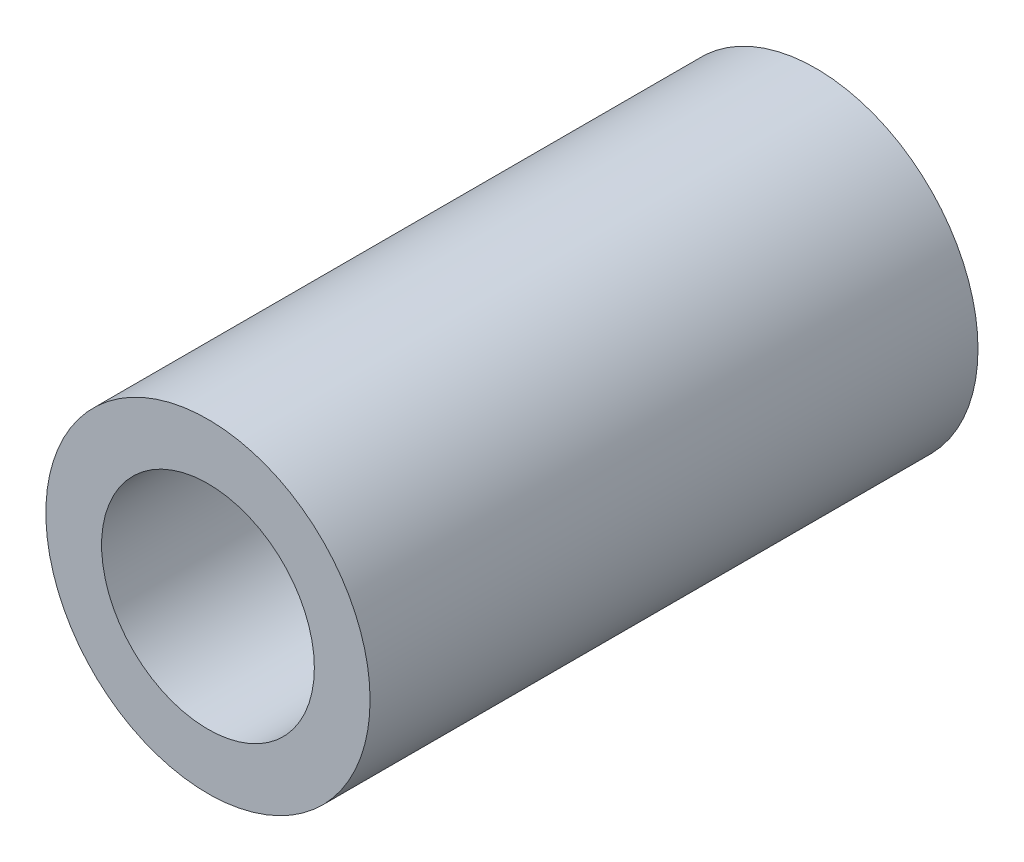
ISO-10303-21;
HEADER;
FILE_DESCRIPTION(('STEP AP214'),'2;1');
FILE_NAME('part.step','',(''),(''),'','','');
FILE_SCHEMA(('AUTOMOTIVE_DESIGN { 1 0 10303 214 1 1 1 1 }'));
ENDSEC;
DATA;
#1=APPLICATION_CONTEXT('core data for automotive mechanical design processes');
#2=APPLICATION_PROTOCOL_DEFINITION('international standard','automotive_design',2000,#1);
#3=PRODUCT_CONTEXT('',#1,'mechanical');
#4=PRODUCT('Part','Part','',(#3));
#5=PRODUCT_RELATED_PRODUCT_CATEGORY('part','',(#4));
#6=PRODUCT_DEFINITION_FORMATION('','',#4);
#7=PRODUCT_DEFINITION_CONTEXT('part definition',#1,'design');
#8=PRODUCT_DEFINITION('design','',#6,#7);
#9=PRODUCT_DEFINITION_SHAPE('','',#8);
#10=(LENGTH_UNIT() NAMED_UNIT(*) SI_UNIT(.MILLI.,.METRE.));
#11=(NAMED_UNIT(*) PLANE_ANGLE_UNIT() SI_UNIT($,.RADIAN.));
#12=(NAMED_UNIT(*) SI_UNIT($,.STERADIAN.) SOLID_ANGLE_UNIT());
#13=UNCERTAINTY_MEASURE_WITH_UNIT(LENGTH_MEASURE(1.E-05),#10,'distance_accuracy_value','');
#14=(GEOMETRIC_REPRESENTATION_CONTEXT(3) GLOBAL_UNCERTAINTY_ASSIGNED_CONTEXT((#13)) GLOBAL_UNIT_ASSIGNED_CONTEXT((#10,
#11,#12)) REPRESENTATION_CONTEXT('',''));
#15=CARTESIAN_POINT('',(0.,0.,0.));
#16=DIRECTION('',(0.,0.,1.));
#17=DIRECTION('',(1.,0.,0.));
#18=AXIS2_PLACEMENT_3D('',#15,#16,#17);
#19=CARTESIAN_POINT('',(0.,0.,15.));
#20=DIRECTION('',(0.,0.,1.));
#21=DIRECTION('',(1.,0.,0.));
#22=AXIS2_PLACEMENT_3D('',#19,#20,#21);
#23=PLANE('',#22);
#24=CARTESIAN_POINT('',(0.,0.,15.));
#25=DIRECTION('',(0.,0.,1.));
#26=DIRECTION('',(1.,0.,0.));
#27=AXIS2_PLACEMENT_3D('',#24,#25,#26);
#28=CIRCLE('',#27,8.);
#29=CARTESIAN_POINT('',(8.,0.,15.));
#30=VERTEX_POINT('',#29);
#31=EDGE_CURVE('E10',#30,#30,#28,.T.);
#32=ORIENTED_EDGE('',*,*,#31,.T.);
#33=EDGE_LOOP('',(#32));
#34=FACE_BOUND('',#33,.T.);
#35=CARTESIAN_POINT('',(0.,0.,15.));
#36=DIRECTION('',(0.,0.,1.));
#37=DIRECTION('',(1.,0.,0.));
#38=AXIS2_PLACEMENT_3D('',#35,#36,#37);
#39=CIRCLE('',#38,5.25);
#40=CARTESIAN_POINT('',(5.25,0.,15.));
#41=VERTEX_POINT('',#40);
#42=EDGE_CURVE('E44',#41,#41,#39,.T.);
#43=ORIENTED_EDGE('',*,*,#42,.F.);
#44=EDGE_LOOP('',(#43));
#45=FACE_BOUND('',#44,.T.);
#46=ADVANCED_FACE('F33',(#34,#45),#23,.T.);
#47=CARTESIAN_POINT('',(0.,0.,-15.));
#48=DIRECTION('',(0.,0.,1.));
#49=DIRECTION('',(1.,0.,0.));
#50=AXIS2_PLACEMENT_3D('',#47,#48,#49);
#51=PLANE('',#50);
#52=CARTESIAN_POINT('',(0.,0.,-15.));
#53=DIRECTION('',(0.,0.,1.));
#54=DIRECTION('',(1.,0.,0.));
#55=AXIS2_PLACEMENT_3D('',#52,#53,#54);
#56=CIRCLE('',#55,8.);
#57=CARTESIAN_POINT('',(8.,0.,-15.));
#58=VERTEX_POINT('',#57);
#59=EDGE_CURVE('E37',#58,#58,#56,.T.);
#60=ORIENTED_EDGE('',*,*,#59,.F.);
#61=EDGE_LOOP('',(#60));
#62=FACE_BOUND('',#61,.T.);
#63=CARTESIAN_POINT('',(0.,0.,-15.));
#64=DIRECTION('',(0.,0.,1.));
#65=DIRECTION('',(1.,0.,0.));
#66=AXIS2_PLACEMENT_3D('',#63,#64,#65);
#67=CIRCLE('',#66,5.25);
#68=CARTESIAN_POINT('',(5.25,0.,-15.));
#69=VERTEX_POINT('',#68);
#70=EDGE_CURVE('E46',#69,#69,#67,.T.);
#71=ORIENTED_EDGE('',*,*,#70,.T.);
#72=EDGE_LOOP('',(#71));
#73=FACE_BOUND('',#72,.T.);
#74=ADVANCED_FACE('F56',(#62,#73),#51,.F.);
#75=CARTESIAN_POINT('',(0.,0.,15.));
#76=DIRECTION('',(0.,0.,-1.));
#77=DIRECTION('',(-1.,0.,0.));
#78=AXIS2_PLACEMENT_3D('',#75,#76,#77);
#79=CYLINDRICAL_SURFACE('',#78,8.);
#80=ORIENTED_EDGE('',*,*,#31,.F.);
#81=EDGE_LOOP('',(#80));
#82=FACE_BOUND('',#81,.T.);
#83=ORIENTED_EDGE('',*,*,#59,.T.);
#84=EDGE_LOOP('',(#83));
#85=FACE_BOUND('',#84,.T.);
#86=ADVANCED_FACE('F35',(#82,#85),#79,.T.);
#87=CARTESIAN_POINT('',(0.,0.,15.));
#88=DIRECTION('',(0.,0.,-1.));
#89=DIRECTION('',(-1.,0.,0.));
#90=AXIS2_PLACEMENT_3D('',#87,#88,#89);
#91=CYLINDRICAL_SURFACE('',#90,5.25);
#92=ORIENTED_EDGE('',*,*,#42,.T.);
#93=EDGE_LOOP('',(#92));
#94=FACE_BOUND('',#93,.T.);
#95=ORIENTED_EDGE('',*,*,#70,.F.);
#96=EDGE_LOOP('',(#95));
#97=FACE_BOUND('',#96,.T.);
#98=ADVANCED_FACE('F52',(#94,#97),#91,.F.);
#99=CLOSED_SHELL('',(#46,#74,#86,#98));
#100=MANIFOLD_SOLID_BREP('B2',#99);
#101=ADVANCED_BREP_SHAPE_REPRESENTATION('',(#18,#100),#14);
#102=SHAPE_DEFINITION_REPRESENTATION(#9,#101);
ENDSEC;
END-ISO-10303-21;
